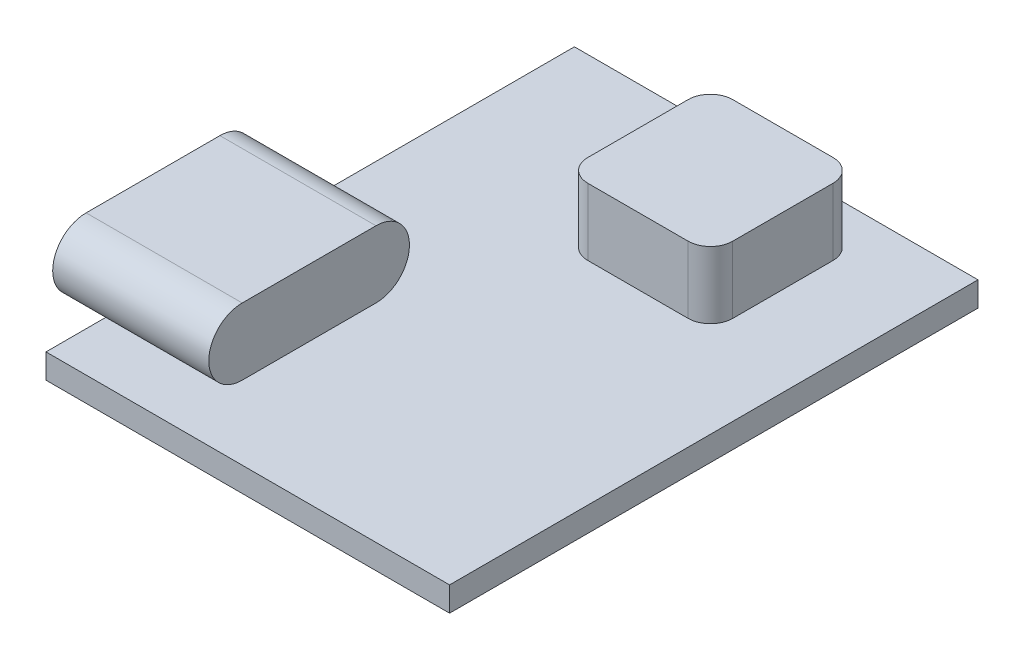
ISO-10303-21;
HEADER;
FILE_DESCRIPTION(('STEP AP214'),'2;1');
FILE_NAME('part.step','',(''),(''),'','','');
FILE_SCHEMA(('AUTOMOTIVE_DESIGN { 1 0 10303 214 1 1 1 1 }'));
ENDSEC;
DATA;
#1=APPLICATION_CONTEXT('core data for automotive mechanical design processes');
#2=APPLICATION_PROTOCOL_DEFINITION('international standard','automotive_design',2000,#1);
#3=PRODUCT_CONTEXT('',#1,'mechanical');
#4=PRODUCT('Part','Part','',(#3));
#5=PRODUCT_RELATED_PRODUCT_CATEGORY('part','',(#4));
#6=PRODUCT_DEFINITION_FORMATION('','',#4);
#7=PRODUCT_DEFINITION_CONTEXT('part definition',#1,'design');
#8=PRODUCT_DEFINITION('design','',#6,#7);
#9=PRODUCT_DEFINITION_SHAPE('','',#8);
#10=(LENGTH_UNIT() NAMED_UNIT(*) SI_UNIT(.MILLI.,.METRE.));
#11=(NAMED_UNIT(*) PLANE_ANGLE_UNIT() SI_UNIT($,.RADIAN.));
#12=(NAMED_UNIT(*) SI_UNIT($,.STERADIAN.) SOLID_ANGLE_UNIT());
#13=UNCERTAINTY_MEASURE_WITH_UNIT(LENGTH_MEASURE(1.E-05),#10,'distance_accuracy_value','');
#14=(GEOMETRIC_REPRESENTATION_CONTEXT(3) GLOBAL_UNCERTAINTY_ASSIGNED_CONTEXT((#13)) GLOBAL_UNIT_ASSIGNED_CONTEXT((#10,
#11,#12)) REPRESENTATION_CONTEXT('',''));
#15=CARTESIAN_POINT('',(0.,0.,0.));
#16=DIRECTION('',(0.,0.,1.));
#17=DIRECTION('',(1.,0.,0.));
#18=AXIS2_PLACEMENT_3D('',#15,#16,#17);
#19=CARTESIAN_POINT('',(-1.45,4.1,-10.35));
#20=DIRECTION('',(1.,0.,0.));
#21=DIRECTION('',(0.,0.,-1.));
#22=AXIS2_PLACEMENT_3D('',#19,#20,#21);
#23=PLANE('',#22);
#24=DIRECTION('',(0.,0.,1.));
#25=VECTOR('',#24,1.);
#26=CARTESIAN_POINT('',(-1.45,4.1,-10.35));
#27=LINE('',#26,#25);
#28=CARTESIAN_POINT('',(-1.45,4.1,-9.35));
#29=VERTEX_POINT('',#28);
#30=CARTESIAN_POINT('',(-1.45,4.1,-4.85));
#31=VERTEX_POINT('',#30);
#32=EDGE_CURVE('E143',#29,#31,#27,.T.);
#33=ORIENTED_EDGE('',*,*,#32,.F.);
#34=DIRECTION('',(0.,-1.,0.));
#35=VECTOR('',#34,1.);
#36=CARTESIAN_POINT('',(-1.45,4.1,-9.35));
#37=LINE('',#36,#35);
#38=CARTESIAN_POINT('',(-1.45,1.1,-9.35));
#39=VERTEX_POINT('',#38);
#40=EDGE_CURVE('E169',#29,#39,#37,.T.);
#41=ORIENTED_EDGE('',*,*,#40,.T.);
#42=DIRECTION('',(0.,0.,1.));
#43=VECTOR('',#42,1.);
#44=CARTESIAN_POINT('',(-1.45,1.1,-10.35));
#45=LINE('',#44,#43);
#46=CARTESIAN_POINT('',(-1.45,1.1,-4.85));
#47=VERTEX_POINT('',#46);
#48=EDGE_CURVE('E175',#39,#47,#45,.T.);
#49=ORIENTED_EDGE('',*,*,#48,.T.);
#50=DIRECTION('',(0.,-1.,0.));
#51=VECTOR('',#50,1.);
#52=CARTESIAN_POINT('',(-1.45,4.1,-4.85));
#53=LINE('',#52,#51);
#54=EDGE_CURVE('E167',#47,#31,#53,.F.);
#55=ORIENTED_EDGE('',*,*,#54,.T.);
#56=EDGE_LOOP('',(#33,#41,#49,#55));
#57=FACE_BOUND('',#56,.T.);
#58=ADVANCED_FACE('F51',(#57),#23,.F.);
#59=CARTESIAN_POINT('',(-1.45,4.1,-3.85));
#60=DIRECTION('',(0.,0.,-1.));
#61=DIRECTION('',(-1.,0.,0.));
#62=AXIS2_PLACEMENT_3D('',#59,#60,#61);
#63=PLANE('',#62);
#64=DIRECTION('',(1.,0.,0.));
#65=VECTOR('',#64,1.);
#66=CARTESIAN_POINT('',(-1.45,4.1,-3.85));
#67=LINE('',#66,#65);
#68=CARTESIAN_POINT('',(-0.449999999999999,4.1,-3.85));
#69=VERTEX_POINT('',#68);
#70=CARTESIAN_POINT('',(4.05,4.1,-3.85));
#71=VERTEX_POINT('',#70);
#72=EDGE_CURVE('E146',#69,#71,#67,.T.);
#73=ORIENTED_EDGE('',*,*,#72,.F.);
#74=DIRECTION('',(0.,-1.,0.));
#75=VECTOR('',#74,1.);
#76=CARTESIAN_POINT('',(-0.449999999999999,4.1,-3.85));
#77=LINE('',#76,#75);
#78=CARTESIAN_POINT('',(-0.449999999999999,1.1,-3.85));
#79=VERTEX_POINT('',#78);
#80=EDGE_CURVE('E12',#69,#79,#77,.T.);
#81=ORIENTED_EDGE('',*,*,#80,.T.);
#82=DIRECTION('',(1.,0.,0.));
#83=VECTOR('',#82,1.);
#84=CARTESIAN_POINT('',(-1.45,1.1,-3.85));
#85=LINE('',#84,#83);
#86=CARTESIAN_POINT('',(4.05,1.1,-3.85));
#87=VERTEX_POINT('',#86);
#88=EDGE_CURVE('E148',#79,#87,#85,.T.);
#89=ORIENTED_EDGE('',*,*,#88,.T.);
#90=DIRECTION('',(0.,-1.,0.));
#91=VECTOR('',#90,1.);
#92=CARTESIAN_POINT('',(4.05,4.1,-3.85));
#93=LINE('',#92,#91);
#94=EDGE_CURVE('E59',#87,#71,#93,.F.);
#95=ORIENTED_EDGE('',*,*,#94,.T.);
#96=EDGE_LOOP('',(#73,#81,#89,#95));
#97=FACE_BOUND('',#96,.T.);
#98=ADVANCED_FACE('F194',(#97),#63,.F.);
#99=CARTESIAN_POINT('',(5.05,4.1,-10.35));
#100=DIRECTION('',(-1.,0.,0.));
#101=DIRECTION('',(0.,0.,1.));
#102=AXIS2_PLACEMENT_3D('',#99,#100,#101);
#103=PLANE('',#102);
#104=DIRECTION('',(0.,0.,-1.));
#105=VECTOR('',#104,1.);
#106=CARTESIAN_POINT('',(5.05,1.1,-10.35));
#107=LINE('',#106,#105);
#108=CARTESIAN_POINT('',(5.05,1.1,-4.85));
#109=VERTEX_POINT('',#108);
#110=CARTESIAN_POINT('',(5.05,1.1,-9.35));
#111=VERTEX_POINT('',#110);
#112=EDGE_CURVE('E144',#109,#111,#107,.T.);
#113=ORIENTED_EDGE('',*,*,#112,.T.);
#114=DIRECTION('',(0.,-1.,0.));
#115=VECTOR('',#114,1.);
#116=CARTESIAN_POINT('',(5.05,4.1,-9.35));
#117=LINE('',#116,#115);
#118=CARTESIAN_POINT('',(5.05,4.1,-9.35));
#119=VERTEX_POINT('',#118);
#120=EDGE_CURVE('E122',#111,#119,#117,.F.);
#121=ORIENTED_EDGE('',*,*,#120,.T.);
#122=DIRECTION('',(0.,0.,-1.));
#123=VECTOR('',#122,1.);
#124=CARTESIAN_POINT('',(5.05,4.1,-10.35));
#125=LINE('',#124,#123);
#126=CARTESIAN_POINT('',(5.05,4.1,-4.85));
#127=VERTEX_POINT('',#126);
#128=EDGE_CURVE('E183',#127,#119,#125,.T.);
#129=ORIENTED_EDGE('',*,*,#128,.F.);
#130=DIRECTION('',(0.,-1.,0.));
#131=VECTOR('',#130,1.);
#132=CARTESIAN_POINT('',(5.05,4.1,-4.85));
#133=LINE('',#132,#131);
#134=EDGE_CURVE('E127',#127,#109,#133,.T.);
#135=ORIENTED_EDGE('',*,*,#134,.T.);
#136=EDGE_LOOP('',(#113,#121,#129,#135));
#137=FACE_BOUND('',#136,.T.);
#138=ADVANCED_FACE('F193',(#137),#103,.F.);
#139=CARTESIAN_POINT('',(-1.45,4.1,-10.35));
#140=DIRECTION('',(0.,0.,1.));
#141=DIRECTION('',(1.,0.,0.));
#142=AXIS2_PLACEMENT_3D('',#139,#140,#141);
#143=PLANE('',#142);
#144=DIRECTION('',(-1.,0.,0.));
#145=VECTOR('',#144,1.);
#146=CARTESIAN_POINT('',(-1.45,4.1,-10.35));
#147=LINE('',#146,#145);
#148=CARTESIAN_POINT('',(4.05,4.1,-10.35));
#149=VERTEX_POINT('',#148);
#150=CARTESIAN_POINT('',(-0.45,4.1,-10.35));
#151=VERTEX_POINT('',#150);
#152=EDGE_CURVE('E137',#149,#151,#147,.T.);
#153=ORIENTED_EDGE('',*,*,#152,.F.);
#154=DIRECTION('',(0.,-1.,0.));
#155=VECTOR('',#154,1.);
#156=CARTESIAN_POINT('',(4.05,4.1,-10.35));
#157=LINE('',#156,#155);
#158=CARTESIAN_POINT('',(4.05,1.1,-10.35));
#159=VERTEX_POINT('',#158);
#160=EDGE_CURVE('E121',#149,#159,#157,.T.);
#161=ORIENTED_EDGE('',*,*,#160,.T.);
#162=DIRECTION('',(-1.,0.,0.));
#163=VECTOR('',#162,1.);
#164=CARTESIAN_POINT('',(-1.45,1.1,-10.35));
#165=LINE('',#164,#163);
#166=CARTESIAN_POINT('',(-0.45,1.1,-10.35));
#167=VERTEX_POINT('',#166);
#168=EDGE_CURVE('E134',#159,#167,#165,.T.);
#169=ORIENTED_EDGE('',*,*,#168,.T.);
#170=DIRECTION('',(0.,-1.,0.));
#171=VECTOR('',#170,1.);
#172=CARTESIAN_POINT('',(-0.45,4.1,-10.35));
#173=LINE('',#172,#171);
#174=EDGE_CURVE('E139',#167,#151,#173,.F.);
#175=ORIENTED_EDGE('',*,*,#174,.T.);
#176=EDGE_LOOP('',(#153,#161,#169,#175));
#177=FACE_BOUND('',#176,.T.);
#178=ADVANCED_FACE('F133',(#177),#143,.F.);
#179=CARTESIAN_POINT('',(0.,4.1,0.));
#180=DIRECTION('',(0.,1.,0.));
#181=DIRECTION('',(0.,0.,1.));
#182=AXIS2_PLACEMENT_3D('',#179,#180,#181);
#183=PLANE('',#182);
#184=ORIENTED_EDGE('',*,*,#128,.T.);
#185=CARTESIAN_POINT('',(4.05,4.1,-9.35));
#186=DIRECTION('',(0.,1.,0.));
#187=DIRECTION('',(0.,0.,1.));
#188=AXIS2_PLACEMENT_3D('',#185,#186,#187);
#189=CIRCLE('',#188,1.);
#190=EDGE_CURVE('E165',#119,#149,#189,.T.);
#191=ORIENTED_EDGE('',*,*,#190,.T.);
#192=ORIENTED_EDGE('',*,*,#152,.T.);
#193=CARTESIAN_POINT('',(-0.45,4.1,-9.35));
#194=DIRECTION('',(0.,1.,0.));
#195=DIRECTION('',(0.,0.,1.));
#196=AXIS2_PLACEMENT_3D('',#193,#194,#195);
#197=CIRCLE('',#196,1.);
#198=EDGE_CURVE('E163',#151,#29,#197,.T.);
#199=ORIENTED_EDGE('',*,*,#198,.T.);
#200=ORIENTED_EDGE('',*,*,#32,.T.);
#201=CARTESIAN_POINT('',(-0.449999999999999,4.1,-4.85));
#202=DIRECTION('',(0.,1.,0.));
#203=DIRECTION('',(0.,0.,1.));
#204=AXIS2_PLACEMENT_3D('',#201,#202,#203);
#205=CIRCLE('',#204,1.);
#206=EDGE_CURVE('E72',#31,#69,#205,.T.);
#207=ORIENTED_EDGE('',*,*,#206,.T.);
#208=ORIENTED_EDGE('',*,*,#72,.T.);
#209=CARTESIAN_POINT('',(4.05,4.1,-4.85));
#210=DIRECTION('',(0.,1.,0.));
#211=DIRECTION('',(0.,0.,1.));
#212=AXIS2_PLACEMENT_3D('',#209,#210,#211);
#213=CIRCLE('',#212,1.);
#214=EDGE_CURVE('E160',#71,#127,#213,.T.);
#215=ORIENTED_EDGE('',*,*,#214,.T.);
#216=EDGE_LOOP('',(#184,#191,#192,#199,#200,#207,#208,#215));
#217=FACE_BOUND('',#216,.T.);
#218=ADVANCED_FACE('F187',(#217),#183,.T.);
#219=CARTESIAN_POINT('',(0.,1.1,0.));
#220=DIRECTION('',(0.,1.,0.));
#221=DIRECTION('',(0.,0.,1.));
#222=AXIS2_PLACEMENT_3D('',#219,#220,#221);
#223=PLANE('',#222);
#224=ORIENTED_EDGE('',*,*,#168,.F.);
#225=CARTESIAN_POINT('',(4.05,1.1,-9.35));
#226=DIRECTION('',(0.,1.,0.));
#227=DIRECTION('',(0.,0.,1.));
#228=AXIS2_PLACEMENT_3D('',#225,#226,#227);
#229=CIRCLE('',#228,1.);
#230=EDGE_CURVE('E117',#159,#111,#229,.F.);
#231=ORIENTED_EDGE('',*,*,#230,.T.);
#232=ORIENTED_EDGE('',*,*,#112,.F.);
#233=CARTESIAN_POINT('',(4.05,1.1,-4.85));
#234=DIRECTION('',(0.,1.,0.));
#235=DIRECTION('',(0.,0.,1.));
#236=AXIS2_PLACEMENT_3D('',#233,#234,#235);
#237=CIRCLE('',#236,1.);
#238=EDGE_CURVE('E138',#109,#87,#237,.F.);
#239=ORIENTED_EDGE('',*,*,#238,.T.);
#240=ORIENTED_EDGE('',*,*,#88,.F.);
#241=CARTESIAN_POINT('',(-0.449999999999999,1.1,-4.85));
#242=DIRECTION('',(0.,1.,0.));
#243=DIRECTION('',(0.,0.,1.));
#244=AXIS2_PLACEMENT_3D('',#241,#242,#243);
#245=CIRCLE('',#244,1.);
#246=EDGE_CURVE('E154',#79,#47,#245,.F.);
#247=ORIENTED_EDGE('',*,*,#246,.T.);
#248=ORIENTED_EDGE('',*,*,#48,.F.);
#249=CARTESIAN_POINT('',(-0.45,1.1,-9.35));
#250=DIRECTION('',(0.,1.,0.));
#251=DIRECTION('',(0.,0.,1.));
#252=AXIS2_PLACEMENT_3D('',#249,#250,#251);
#253=CIRCLE('',#252,1.);
#254=EDGE_CURVE('E128',#39,#167,#253,.F.);
#255=ORIENTED_EDGE('',*,*,#254,.T.);
#256=EDGE_LOOP('',(#224,#231,#232,#239,#240,#247,#248,#255));
#257=FACE_BOUND('',#256,.T.);
#258=ADVANCED_FACE('F141',(#257),#223,.F.);
#259=CARTESIAN_POINT('',(4.05,4.1,-9.35));
#260=DIRECTION('',(0.,-1.,0.));
#261=DIRECTION('',(0.,0.,-1.));
#262=AXIS2_PLACEMENT_3D('',#259,#260,#261);
#263=CYLINDRICAL_SURFACE('',#262,1.);
#264=ORIENTED_EDGE('',*,*,#190,.F.);
#265=ORIENTED_EDGE('',*,*,#120,.F.);
#266=ORIENTED_EDGE('',*,*,#230,.F.);
#267=ORIENTED_EDGE('',*,*,#160,.F.);
#268=EDGE_LOOP('',(#264,#265,#266,#267));
#269=FACE_BOUND('',#268,.T.);
#270=ADVANCED_FACE('F120',(#269),#263,.T.);
#271=CARTESIAN_POINT('',(-0.45,4.1,-9.35));
#272=DIRECTION('',(0.,-1.,0.));
#273=DIRECTION('',(0.,0.,-1.));
#274=AXIS2_PLACEMENT_3D('',#271,#272,#273);
#275=CYLINDRICAL_SURFACE('',#274,1.);
#276=ORIENTED_EDGE('',*,*,#198,.F.);
#277=ORIENTED_EDGE('',*,*,#174,.F.);
#278=ORIENTED_EDGE('',*,*,#254,.F.);
#279=ORIENTED_EDGE('',*,*,#40,.F.);
#280=EDGE_LOOP('',(#276,#277,#278,#279));
#281=FACE_BOUND('',#280,.T.);
#282=ADVANCED_FACE('F197',(#281),#275,.T.);
#283=CARTESIAN_POINT('',(-0.449999999999999,4.1,-4.85));
#284=DIRECTION('',(0.,-1.,0.));
#285=DIRECTION('',(0.,0.,-1.));
#286=AXIS2_PLACEMENT_3D('',#283,#284,#285);
#287=CYLINDRICAL_SURFACE('',#286,1.);
#288=ORIENTED_EDGE('',*,*,#206,.F.);
#289=ORIENTED_EDGE('',*,*,#54,.F.);
#290=ORIENTED_EDGE('',*,*,#246,.F.);
#291=ORIENTED_EDGE('',*,*,#80,.F.);
#292=EDGE_LOOP('',(#288,#289,#290,#291));
#293=FACE_BOUND('',#292,.T.);
#294=ADVANCED_FACE('F196',(#293),#287,.T.);
#295=CARTESIAN_POINT('',(4.05,4.1,-4.85));
#296=DIRECTION('',(0.,-1.,0.));
#297=DIRECTION('',(0.,0.,-1.));
#298=AXIS2_PLACEMENT_3D('',#295,#296,#297);
#299=CYLINDRICAL_SURFACE('',#298,1.);
#300=ORIENTED_EDGE('',*,*,#214,.F.);
#301=ORIENTED_EDGE('',*,*,#94,.F.);
#302=ORIENTED_EDGE('',*,*,#238,.F.);
#303=ORIENTED_EDGE('',*,*,#134,.F.);
#304=EDGE_LOOP('',(#300,#301,#302,#303));
#305=FACE_BOUND('',#304,.T.);
#306=ADVANCED_FACE('F53',(#305),#299,.T.);
#307=CLOSED_SHELL('',(#58,#98,#138,#178,#218,#258,#270,#282,#294,#306));
#308=MANIFOLD_SOLID_BREP('B2',#307);
#309=CARTESIAN_POINT('',(-3.55,2.6,2.55));
#310=DIRECTION('',(-1.,0.,0.));
#311=DIRECTION('',(0.,0.,1.));
#312=AXIS2_PLACEMENT_3D('',#309,#310,#311);
#313=CYLINDRICAL_SURFACE('',#312,1.5);
#314=DIRECTION('',(-1.,0.,0.));
#315=VECTOR('',#314,1.);
#316=CARTESIAN_POINT('',(-3.55,1.1,2.55));
#317=LINE('',#316,#315);
#318=CARTESIAN_POINT('',(-3.55,1.1,2.55));
#319=VERTEX_POINT('',#318);
#320=CARTESIAN_POINT('',(-10.55,1.1,2.55));
#321=VERTEX_POINT('',#320);
#322=EDGE_CURVE('E290',#319,#321,#317,.T.);
#323=ORIENTED_EDGE('',*,*,#322,.T.);
#324=CARTESIAN_POINT('',(-10.55,2.6,2.55));
#325=DIRECTION('',(-1.,0.,0.));
#326=DIRECTION('',(0.,0.,1.));
#327=AXIS2_PLACEMENT_3D('',#324,#325,#326);
#328=CIRCLE('',#327,1.5);
#329=CARTESIAN_POINT('',(-10.55,4.1,2.55));
#330=VERTEX_POINT('',#329);
#331=EDGE_CURVE('E392',#330,#321,#328,.T.);
#332=ORIENTED_EDGE('',*,*,#331,.F.);
#333=DIRECTION('',(-1.,0.,0.));
#334=VECTOR('',#333,1.);
#335=CARTESIAN_POINT('',(-3.55,4.1,2.55));
#336=LINE('',#335,#334);
#337=CARTESIAN_POINT('',(-3.55,4.1,2.55));
#338=VERTEX_POINT('',#337);
#339=EDGE_CURVE('E49',#338,#330,#336,.T.);
#340=ORIENTED_EDGE('',*,*,#339,.F.);
#341=CARTESIAN_POINT('',(-3.55,2.6,2.55));
#342=DIRECTION('',(-1.,0.,0.));
#343=DIRECTION('',(0.,0.,1.));
#344=AXIS2_PLACEMENT_3D('',#341,#342,#343);
#345=CIRCLE('',#344,1.5);
#346=EDGE_CURVE('E404',#338,#319,#345,.T.);
#347=ORIENTED_EDGE('',*,*,#346,.T.);
#348=EDGE_LOOP('',(#323,#332,#340,#347));
#349=FACE_BOUND('',#348,.T.);
#350=ADVANCED_FACE('F287',(#349),#313,.T.);
#351=CARTESIAN_POINT('',(-3.55,4.1,2.55));
#352=DIRECTION('',(0.,1.,0.));
#353=DIRECTION('',(0.,0.,1.));
#354=AXIS2_PLACEMENT_3D('',#351,#352,#353);
#355=PLANE('',#354);
#356=ORIENTED_EDGE('',*,*,#339,.T.);
#357=DIRECTION('',(0.,0.,-1.));
#358=VECTOR('',#357,1.);
#359=CARTESIAN_POINT('',(-10.55,4.1,2.55));
#360=LINE('',#359,#358);
#361=CARTESIAN_POINT('',(-10.55,4.1,8.55));
#362=VERTEX_POINT('',#361);
#363=EDGE_CURVE('E401',#362,#330,#360,.T.);
#364=ORIENTED_EDGE('',*,*,#363,.F.);
#365=DIRECTION('',(-1.,0.,0.));
#366=VECTOR('',#365,1.);
#367=CARTESIAN_POINT('',(-3.55,4.1,8.55));
#368=LINE('',#367,#366);
#369=CARTESIAN_POINT('',(-3.55,4.1,8.55));
#370=VERTEX_POINT('',#369);
#371=EDGE_CURVE('E295',#370,#362,#368,.T.);
#372=ORIENTED_EDGE('',*,*,#371,.F.);
#373=DIRECTION('',(0.,0.,-1.));
#374=VECTOR('',#373,1.);
#375=CARTESIAN_POINT('',(-3.55,4.1,2.55));
#376=LINE('',#375,#374);
#377=EDGE_CURVE('E412',#370,#338,#376,.T.);
#378=ORIENTED_EDGE('',*,*,#377,.T.);
#379=EDGE_LOOP('',(#356,#364,#372,#378));
#380=FACE_BOUND('',#379,.T.);
#381=ADVANCED_FACE('F425',(#380),#355,.T.);
#382=CARTESIAN_POINT('',(-3.55,2.6,8.55));
#383=DIRECTION('',(-1.,0.,0.));
#384=DIRECTION('',(0.,0.,1.));
#385=AXIS2_PLACEMENT_3D('',#382,#383,#384);
#386=CYLINDRICAL_SURFACE('',#385,1.5);
#387=ORIENTED_EDGE('',*,*,#371,.T.);
#388=CARTESIAN_POINT('',(-10.55,2.6,8.55));
#389=DIRECTION('',(-1.,0.,0.));
#390=DIRECTION('',(0.,0.,1.));
#391=AXIS2_PLACEMENT_3D('',#388,#389,#390);
#392=CIRCLE('',#391,1.5);
#393=CARTESIAN_POINT('',(-10.55,1.1,8.55));
#394=VERTEX_POINT('',#393);
#395=EDGE_CURVE('E398',#394,#362,#392,.T.);
#396=ORIENTED_EDGE('',*,*,#395,.F.);
#397=DIRECTION('',(-1.,0.,0.));
#398=VECTOR('',#397,1.);
#399=CARTESIAN_POINT('',(-3.55,1.1,8.55));
#400=LINE('',#399,#398);
#401=CARTESIAN_POINT('',(-3.55,1.1,8.55));
#402=VERTEX_POINT('',#401);
#403=EDGE_CURVE('E415',#402,#394,#400,.T.);
#404=ORIENTED_EDGE('',*,*,#403,.F.);
#405=CARTESIAN_POINT('',(-3.55,2.6,8.55));
#406=DIRECTION('',(-1.,0.,0.));
#407=DIRECTION('',(0.,0.,1.));
#408=AXIS2_PLACEMENT_3D('',#405,#406,#407);
#409=CIRCLE('',#408,1.5);
#410=EDGE_CURVE('E409',#402,#370,#409,.T.);
#411=ORIENTED_EDGE('',*,*,#410,.T.);
#412=EDGE_LOOP('',(#387,#396,#404,#411));
#413=FACE_BOUND('',#412,.T.);
#414=ADVANCED_FACE('F431',(#413),#386,.T.);
#415=CARTESIAN_POINT('',(-3.55,1.1,2.55));
#416=DIRECTION('',(0.,-1.,0.));
#417=DIRECTION('',(0.,0.,-1.));
#418=AXIS2_PLACEMENT_3D('',#415,#416,#417);
#419=PLANE('',#418);
#420=ORIENTED_EDGE('',*,*,#403,.T.);
#421=DIRECTION('',(0.,0.,1.));
#422=VECTOR('',#421,1.);
#423=CARTESIAN_POINT('',(-10.55,1.1,2.55));
#424=LINE('',#423,#422);
#425=EDGE_CURVE('E395',#321,#394,#424,.T.);
#426=ORIENTED_EDGE('',*,*,#425,.F.);
#427=ORIENTED_EDGE('',*,*,#322,.F.);
#428=DIRECTION('',(0.,0.,1.));
#429=VECTOR('',#428,1.);
#430=CARTESIAN_POINT('',(-3.55,1.1,2.55));
#431=LINE('',#430,#429);
#432=EDGE_CURVE('E406',#319,#402,#431,.T.);
#433=ORIENTED_EDGE('',*,*,#432,.T.);
#434=EDGE_LOOP('',(#420,#426,#427,#433));
#435=FACE_BOUND('',#434,.T.);
#436=ADVANCED_FACE('F419',(#435),#419,.T.);
#437=CARTESIAN_POINT('',(-3.55,2.6,2.55));
#438=DIRECTION('',(-1.,0.,0.));
#439=DIRECTION('',(0.,0.,1.));
#440=AXIS2_PLACEMENT_3D('',#437,#438,#439);
#441=PLANE('',#440);
#442=ORIENTED_EDGE('',*,*,#346,.F.);
#443=ORIENTED_EDGE('',*,*,#377,.F.);
#444=ORIENTED_EDGE('',*,*,#410,.F.);
#445=ORIENTED_EDGE('',*,*,#432,.F.);
#446=EDGE_LOOP('',(#442,#443,#444,#445));
#447=FACE_BOUND('',#446,.T.);
#448=ADVANCED_FACE('F429',(#447),#441,.F.);
#449=CARTESIAN_POINT('',(-10.55,2.6,2.55));
#450=DIRECTION('',(-1.,0.,0.));
#451=DIRECTION('',(0.,0.,1.));
#452=AXIS2_PLACEMENT_3D('',#449,#450,#451);
#453=PLANE('',#452);
#454=CARTESIAN_POINT('',(-10.55,2.6,2.55));
#455=DIRECTION('',(-1.,0.,0.));
#456=DIRECTION('',(0.,0.,1.));
#457=AXIS2_PLACEMENT_3D('',#454,#455,#456);
#458=CIRCLE('',#457,1.2);
#459=CARTESIAN_POINT('',(-10.55,3.8,2.55));
#460=VERTEX_POINT('',#459);
#461=CARTESIAN_POINT('',(-10.55,1.4,2.55));
#462=VERTEX_POINT('',#461);
#463=EDGE_CURVE('E359',#460,#462,#458,.T.);
#464=ORIENTED_EDGE('',*,*,#463,.F.);
#465=DIRECTION('',(0.,0.,-1.));
#466=VECTOR('',#465,1.);
#467=CARTESIAN_POINT('',(-10.55,3.8,2.55));
#468=LINE('',#467,#466);
#469=CARTESIAN_POINT('',(-10.55,3.8,8.55));
#470=VERTEX_POINT('',#469);
#471=EDGE_CURVE('E376',#470,#460,#468,.T.);
#472=ORIENTED_EDGE('',*,*,#471,.F.);
#473=CARTESIAN_POINT('',(-10.55,2.6,8.55));
#474=DIRECTION('',(-1.,0.,0.));
#475=DIRECTION('',(0.,0.,1.));
#476=AXIS2_PLACEMENT_3D('',#473,#474,#475);
#477=CIRCLE('',#476,1.2);
#478=CARTESIAN_POINT('',(-10.55,1.4,8.55));
#479=VERTEX_POINT('',#478);
#480=EDGE_CURVE('E303',#479,#470,#477,.T.);
#481=ORIENTED_EDGE('',*,*,#480,.F.);
#482=DIRECTION('',(0.,0.,1.));
#483=VECTOR('',#482,1.);
#484=CARTESIAN_POINT('',(-10.55,1.4,2.55));
#485=LINE('',#484,#483);
#486=EDGE_CURVE('E389',#462,#479,#485,.T.);
#487=ORIENTED_EDGE('',*,*,#486,.F.);
#488=EDGE_LOOP('',(#464,#472,#481,#487));
#489=FACE_BOUND('',#488,.T.);
#490=ORIENTED_EDGE('',*,*,#331,.T.);
#491=ORIENTED_EDGE('',*,*,#425,.T.);
#492=ORIENTED_EDGE('',*,*,#395,.T.);
#493=ORIENTED_EDGE('',*,*,#363,.T.);
#494=EDGE_LOOP('',(#490,#491,#492,#493));
#495=FACE_BOUND('',#494,.T.);
#496=ADVANCED_FACE('F422',(#489,#495),#453,.T.);
#497=CARTESIAN_POINT('',(-3.55,2.6,2.55));
#498=DIRECTION('',(-1.,0.,0.));
#499=DIRECTION('',(0.,0.,1.));
#500=AXIS2_PLACEMENT_3D('',#497,#498,#499);
#501=CYLINDRICAL_SURFACE('',#500,1.2);
#502=DIRECTION('',(-1.,0.,0.));
#503=VECTOR('',#502,1.);
#504=CARTESIAN_POINT('',(-3.55,1.4,2.55));
#505=LINE('',#504,#503);
#506=CARTESIAN_POINT('',(-3.85,1.4,2.55));
#507=VERTEX_POINT('',#506);
#508=EDGE_CURVE('E352',#507,#462,#505,.T.);
#509=ORIENTED_EDGE('',*,*,#508,.F.);
#510=CARTESIAN_POINT('',(-3.85,2.6,2.55));
#511=DIRECTION('',(-1.,0.,0.));
#512=DIRECTION('',(0.,0.,1.));
#513=AXIS2_PLACEMENT_3D('',#510,#511,#512);
#514=CIRCLE('',#513,1.2);
#515=CARTESIAN_POINT('',(-3.85,3.8,2.55));
#516=VERTEX_POINT('',#515);
#517=EDGE_CURVE('E356',#516,#507,#514,.T.);
#518=ORIENTED_EDGE('',*,*,#517,.F.);
#519=DIRECTION('',(1.,0.,0.));
#520=VECTOR('',#519,1.);
#521=CARTESIAN_POINT('',(-3.55,3.8,2.55));
#522=LINE('',#521,#520);
#523=EDGE_CURVE('E382',#516,#460,#522,.F.);
#524=ORIENTED_EDGE('',*,*,#523,.T.);
#525=ORIENTED_EDGE('',*,*,#463,.T.);
#526=EDGE_LOOP('',(#509,#518,#524,#525));
#527=FACE_BOUND('',#526,.T.);
#528=ADVANCED_FACE('F354',(#527),#501,.F.);
#529=CARTESIAN_POINT('',(-3.55,3.8,2.55));
#530=DIRECTION('',(0.,1.,0.));
#531=DIRECTION('',(0.,0.,1.));
#532=AXIS2_PLACEMENT_3D('',#529,#530,#531);
#533=PLANE('',#532);
#534=ORIENTED_EDGE('',*,*,#523,.F.);
#535=DIRECTION('',(0.,0.,-1.));
#536=VECTOR('',#535,1.);
#537=CARTESIAN_POINT('',(-3.85,3.8,2.55));
#538=LINE('',#537,#536);
#539=CARTESIAN_POINT('',(-3.85,3.8,8.55));
#540=VERTEX_POINT('',#539);
#541=EDGE_CURVE('E364',#540,#516,#538,.T.);
#542=ORIENTED_EDGE('',*,*,#541,.F.);
#543=DIRECTION('',(-1.,0.,0.));
#544=VECTOR('',#543,1.);
#545=CARTESIAN_POINT('',(-3.55,3.8,8.55));
#546=LINE('',#545,#544);
#547=EDGE_CURVE('E383',#540,#470,#546,.T.);
#548=ORIENTED_EDGE('',*,*,#547,.T.);
#549=ORIENTED_EDGE('',*,*,#471,.T.);
#550=EDGE_LOOP('',(#534,#542,#548,#549));
#551=FACE_BOUND('',#550,.T.);
#552=ADVANCED_FACE('F484',(#551),#533,.F.);
#553=CARTESIAN_POINT('',(-3.55,2.6,8.55));
#554=DIRECTION('',(-1.,0.,0.));
#555=DIRECTION('',(0.,0.,1.));
#556=AXIS2_PLACEMENT_3D('',#553,#554,#555);
#557=CYLINDRICAL_SURFACE('',#556,1.2);
#558=ORIENTED_EDGE('',*,*,#547,.F.);
#559=CARTESIAN_POINT('',(-3.85,2.6,8.55));
#560=DIRECTION('',(-1.,0.,0.));
#561=DIRECTION('',(0.,0.,1.));
#562=AXIS2_PLACEMENT_3D('',#559,#560,#561);
#563=CIRCLE('',#562,1.2);
#564=CARTESIAN_POINT('',(-3.85,1.4,8.55));
#565=VERTEX_POINT('',#564);
#566=EDGE_CURVE('E372',#565,#540,#563,.T.);
#567=ORIENTED_EDGE('',*,*,#566,.F.);
#568=DIRECTION('',(1.,0.,0.));
#569=VECTOR('',#568,1.);
#570=CARTESIAN_POINT('',(-3.55,1.4,8.55));
#571=LINE('',#570,#569);
#572=EDGE_CURVE('E363',#565,#479,#571,.F.);
#573=ORIENTED_EDGE('',*,*,#572,.T.);
#574=ORIENTED_EDGE('',*,*,#480,.T.);
#575=EDGE_LOOP('',(#558,#567,#573,#574));
#576=FACE_BOUND('',#575,.T.);
#577=ADVANCED_FACE('F493',(#576),#557,.F.);
#578=CARTESIAN_POINT('',(-3.55,1.4,2.55));
#579=DIRECTION('',(0.,-1.,0.));
#580=DIRECTION('',(0.,0.,-1.));
#581=AXIS2_PLACEMENT_3D('',#578,#579,#580);
#582=PLANE('',#581);
#583=ORIENTED_EDGE('',*,*,#572,.F.);
#584=DIRECTION('',(0.,0.,1.));
#585=VECTOR('',#584,1.);
#586=CARTESIAN_POINT('',(-3.85,1.4,2.55));
#587=LINE('',#586,#585);
#588=EDGE_CURVE('E367',#507,#565,#587,.T.);
#589=ORIENTED_EDGE('',*,*,#588,.F.);
#590=ORIENTED_EDGE('',*,*,#508,.T.);
#591=ORIENTED_EDGE('',*,*,#486,.T.);
#592=EDGE_LOOP('',(#583,#589,#590,#591));
#593=FACE_BOUND('',#592,.T.);
#594=ADVANCED_FACE('F368',(#593),#582,.F.);
#595=CARTESIAN_POINT('',(-3.85,2.6,2.55));
#596=DIRECTION('',(-1.,0.,0.));
#597=DIRECTION('',(0.,0.,1.));
#598=AXIS2_PLACEMENT_3D('',#595,#596,#597);
#599=PLANE('',#598);
#600=ORIENTED_EDGE('',*,*,#517,.T.);
#601=ORIENTED_EDGE('',*,*,#588,.T.);
#602=ORIENTED_EDGE('',*,*,#566,.T.);
#603=ORIENTED_EDGE('',*,*,#541,.T.);
#604=EDGE_LOOP('',(#600,#601,#602,#603));
#605=FACE_BOUND('',#604,.T.);
#606=ADVANCED_FACE('F374',(#605),#599,.T.);
#607=CLOSED_SHELL('',(#350,#381,#414,#436,#448,#496,#528,#552,#577,#594,#606));
#608=MANIFOLD_SOLID_BREP('B6',#607);
#609=CARTESIAN_POINT('',(9.05,1.1,-11.85));
#610=DIRECTION('',(-1.,0.,0.));
#611=DIRECTION('',(0.,0.,1.));
#612=AXIS2_PLACEMENT_3D('',#609,#610,#611);
#613=PLANE('',#612);
#614=DIRECTION('',(0.,0.,-1.));
#615=VECTOR('',#614,1.);
#616=CARTESIAN_POINT('',(9.05,0.,-11.85));
#617=LINE('',#616,#615);
#618=CARTESIAN_POINT('',(9.05,0.,11.85));
#619=VERTEX_POINT('',#618);
#620=CARTESIAN_POINT('',(9.05,0.,-11.85));
#621=VERTEX_POINT('',#620);
#622=EDGE_CURVE('E588',#619,#621,#617,.T.);
#623=ORIENTED_EDGE('',*,*,#622,.T.);
#624=DIRECTION('',(0.,-1.,0.));
#625=VECTOR('',#624,1.);
#626=CARTESIAN_POINT('',(9.05,1.1,-11.85));
#627=LINE('',#626,#625);
#628=CARTESIAN_POINT('',(9.05,1.1,-11.85));
#629=VERTEX_POINT('',#628);
#630=EDGE_CURVE('E285',#629,#621,#627,.T.);
#631=ORIENTED_EDGE('',*,*,#630,.F.);
#632=DIRECTION('',(0.,0.,-1.));
#633=VECTOR('',#632,1.);
#634=CARTESIAN_POINT('',(9.05,1.1,-11.85));
#635=LINE('',#634,#633);
#636=CARTESIAN_POINT('',(9.05,1.1,11.85));
#637=VERTEX_POINT('',#636);
#638=EDGE_CURVE('E576',#637,#629,#635,.T.);
#639=ORIENTED_EDGE('',*,*,#638,.F.);
#640=DIRECTION('',(0.,-1.,0.));
#641=VECTOR('',#640,1.);
#642=CARTESIAN_POINT('',(9.05,1.1,11.85));
#643=LINE('',#642,#641);
#644=EDGE_CURVE('E584',#637,#619,#643,.T.);
#645=ORIENTED_EDGE('',*,*,#644,.T.);
#646=EDGE_LOOP('',(#623,#631,#639,#645));
#647=FACE_BOUND('',#646,.T.);
#648=ADVANCED_FACE('F525',(#647),#613,.F.);
#649=CARTESIAN_POINT('',(-9.05,1.1,-11.85));
#650=DIRECTION('',(0.,0.,1.));
#651=DIRECTION('',(1.,0.,0.));
#652=AXIS2_PLACEMENT_3D('',#649,#650,#651);
#653=PLANE('',#652);
#654=DIRECTION('',(-1.,0.,0.));
#655=VECTOR('',#654,1.);
#656=CARTESIAN_POINT('',(-9.05,0.,-11.85));
#657=LINE('',#656,#655);
#658=CARTESIAN_POINT('',(-9.05,0.,-11.85));
#659=VERTEX_POINT('',#658);
#660=EDGE_CURVE('E580',#621,#659,#657,.T.);
#661=ORIENTED_EDGE('',*,*,#660,.T.);
#662=DIRECTION('',(0.,-1.,0.));
#663=VECTOR('',#662,1.);
#664=CARTESIAN_POINT('',(-9.05,1.1,-11.85));
#665=LINE('',#664,#663);
#666=CARTESIAN_POINT('',(-9.05,1.1,-11.85));
#667=VERTEX_POINT('',#666);
#668=EDGE_CURVE('E533',#667,#659,#665,.T.);
#669=ORIENTED_EDGE('',*,*,#668,.F.);
#670=DIRECTION('',(-1.,0.,0.));
#671=VECTOR('',#670,1.);
#672=CARTESIAN_POINT('',(-9.05,1.1,-11.85));
#673=LINE('',#672,#671);
#674=EDGE_CURVE('E571',#629,#667,#673,.T.);
#675=ORIENTED_EDGE('',*,*,#674,.F.);
#676=ORIENTED_EDGE('',*,*,#630,.T.);
#677=EDGE_LOOP('',(#661,#669,#675,#676));
#678=FACE_BOUND('',#677,.T.);
#679=ADVANCED_FACE('F579',(#678),#653,.F.);
#680=CARTESIAN_POINT('',(-9.05,1.1,-11.85));
#681=DIRECTION('',(1.,0.,0.));
#682=DIRECTION('',(0.,0.,-1.));
#683=AXIS2_PLACEMENT_3D('',#680,#681,#682);
#684=PLANE('',#683);
#685=DIRECTION('',(0.,0.,1.));
#686=VECTOR('',#685,1.);
#687=CARTESIAN_POINT('',(-9.05,0.,-11.85));
#688=LINE('',#687,#686);
#689=CARTESIAN_POINT('',(-9.05,0.,11.85));
#690=VERTEX_POINT('',#689);
#691=EDGE_CURVE('E558',#659,#690,#688,.T.);
#692=ORIENTED_EDGE('',*,*,#691,.T.);
#693=DIRECTION('',(0.,-1.,0.));
#694=VECTOR('',#693,1.);
#695=CARTESIAN_POINT('',(-9.05,1.1,11.85));
#696=LINE('',#695,#694);
#697=CARTESIAN_POINT('',(-9.05,1.1,11.85));
#698=VERTEX_POINT('',#697);
#699=EDGE_CURVE('E581',#698,#690,#696,.T.);
#700=ORIENTED_EDGE('',*,*,#699,.F.);
#701=DIRECTION('',(0.,0.,1.));
#702=VECTOR('',#701,1.);
#703=CARTESIAN_POINT('',(-9.05,1.1,-11.85));
#704=LINE('',#703,#702);
#705=EDGE_CURVE('E574',#667,#698,#704,.T.);
#706=ORIENTED_EDGE('',*,*,#705,.F.);
#707=ORIENTED_EDGE('',*,*,#668,.T.);
#708=EDGE_LOOP('',(#692,#700,#706,#707));
#709=FACE_BOUND('',#708,.T.);
#710=ADVANCED_FACE('F582',(#709),#684,.F.);
#711=CARTESIAN_POINT('',(-9.05,1.1,11.85));
#712=DIRECTION('',(0.,0.,-1.));
#713=DIRECTION('',(-1.,0.,0.));
#714=AXIS2_PLACEMENT_3D('',#711,#712,#713);
#715=PLANE('',#714);
#716=DIRECTION('',(1.,0.,0.));
#717=VECTOR('',#716,1.);
#718=CARTESIAN_POINT('',(-9.05,0.,11.85));
#719=LINE('',#718,#717);
#720=EDGE_CURVE('E564',#690,#619,#719,.T.);
#721=ORIENTED_EDGE('',*,*,#720,.T.);
#722=ORIENTED_EDGE('',*,*,#644,.F.);
#723=DIRECTION('',(1.,0.,0.));
#724=VECTOR('',#723,1.);
#725=CARTESIAN_POINT('',(-9.05,1.1,11.85));
#726=LINE('',#725,#724);
#727=EDGE_CURVE('E541',#698,#637,#726,.T.);
#728=ORIENTED_EDGE('',*,*,#727,.F.);
#729=ORIENTED_EDGE('',*,*,#699,.T.);
#730=EDGE_LOOP('',(#721,#722,#728,#729));
#731=FACE_BOUND('',#730,.T.);
#732=ADVANCED_FACE('F595',(#731),#715,.F.);
#733=CARTESIAN_POINT('',(0.,1.1,0.));
#734=DIRECTION('',(0.,1.,0.));
#735=DIRECTION('',(0.,0.,1.));
#736=AXIS2_PLACEMENT_3D('',#733,#734,#735);
#737=PLANE('',#736);
#738=ORIENTED_EDGE('',*,*,#638,.T.);
#739=ORIENTED_EDGE('',*,*,#674,.T.);
#740=ORIENTED_EDGE('',*,*,#705,.T.);
#741=ORIENTED_EDGE('',*,*,#727,.T.);
#742=EDGE_LOOP('',(#738,#739,#740,#741));
#743=FACE_BOUND('',#742,.T.);
#744=ADVANCED_FACE('F572',(#743),#737,.T.);
#745=CARTESIAN_POINT('',(0.,0.,0.));
#746=DIRECTION('',(0.,1.,0.));
#747=DIRECTION('',(0.,0.,1.));
#748=AXIS2_PLACEMENT_3D('',#745,#746,#747);
#749=PLANE('',#748);
#750=ORIENTED_EDGE('',*,*,#622,.F.);
#751=ORIENTED_EDGE('',*,*,#720,.F.);
#752=ORIENTED_EDGE('',*,*,#691,.F.);
#753=ORIENTED_EDGE('',*,*,#660,.F.);
#754=EDGE_LOOP('',(#750,#751,#752,#753));
#755=FACE_BOUND('',#754,.T.);
#756=ADVANCED_FACE('F598',(#755),#749,.F.);
#757=CLOSED_SHELL('',(#648,#679,#710,#732,#744,#756));
#758=MANIFOLD_SOLID_BREP('B43',#757);
#759=ADVANCED_BREP_SHAPE_REPRESENTATION('',(#18,#308,#608,#758),#14);
#760=SHAPE_DEFINITION_REPRESENTATION(#9,#759);
ENDSEC;
END-ISO-10303-21;
